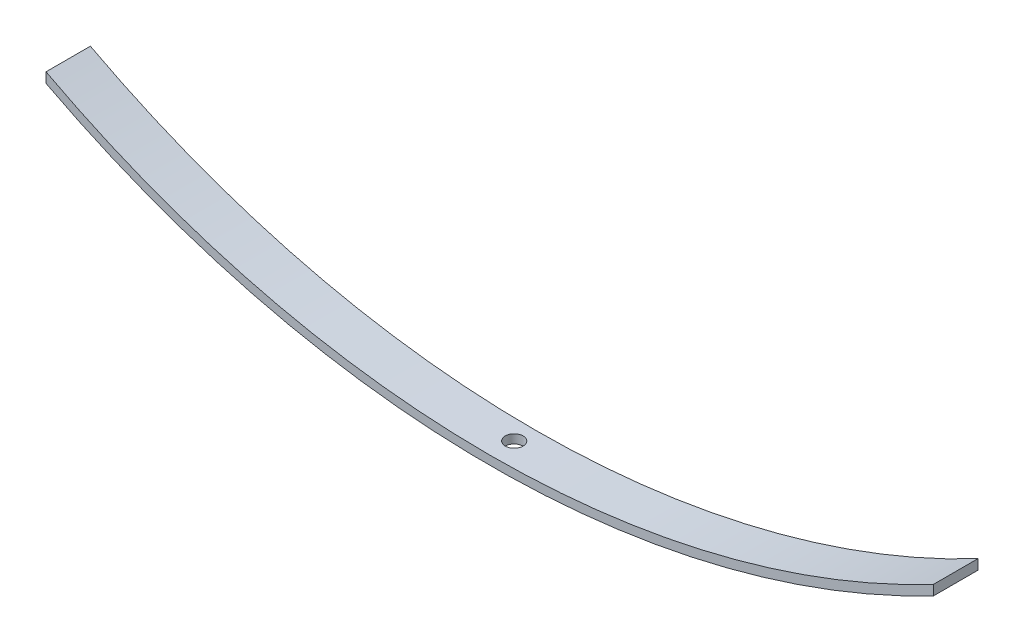
ISO-10303-21;
HEADER;
FILE_DESCRIPTION(('STEP AP214'),'2;1');
FILE_NAME('part.step','',(''),(''),'','','');
FILE_SCHEMA(('AUTOMOTIVE_DESIGN { 1 0 10303 214 1 1 1 1 }'));
ENDSEC;
DATA;
#1=APPLICATION_CONTEXT('core data for automotive mechanical design processes');
#2=APPLICATION_PROTOCOL_DEFINITION('international standard','automotive_design',2000,#1);
#3=PRODUCT_CONTEXT('',#1,'mechanical');
#4=PRODUCT('Part','Part','',(#3));
#5=PRODUCT_RELATED_PRODUCT_CATEGORY('part','',(#4));
#6=PRODUCT_DEFINITION_FORMATION('','',#4);
#7=PRODUCT_DEFINITION_CONTEXT('part definition',#1,'design');
#8=PRODUCT_DEFINITION('design','',#6,#7);
#9=PRODUCT_DEFINITION_SHAPE('','',#8);
#10=(LENGTH_UNIT() NAMED_UNIT(*) SI_UNIT(.MILLI.,.METRE.));
#11=(NAMED_UNIT(*) PLANE_ANGLE_UNIT() SI_UNIT($,.RADIAN.));
#12=(NAMED_UNIT(*) SI_UNIT($,.STERADIAN.) SOLID_ANGLE_UNIT());
#13=UNCERTAINTY_MEASURE_WITH_UNIT(LENGTH_MEASURE(1.E-05),#10,'distance_accuracy_value','');
#14=(GEOMETRIC_REPRESENTATION_CONTEXT(3) GLOBAL_UNCERTAINTY_ASSIGNED_CONTEXT((#13)) GLOBAL_UNIT_ASSIGNED_CONTEXT((#10,
#11,#12)) REPRESENTATION_CONTEXT('',''));
#15=CARTESIAN_POINT('',(0.,0.,0.));
#16=DIRECTION('',(0.,0.,1.));
#17=DIRECTION('',(1.,0.,0.));
#18=AXIS2_PLACEMENT_3D('',#15,#16,#17);
#19=CARTESIAN_POINT('',(-500.,-957.287835501946,50.));
#20=DIRECTION('',(-1.,0.,0.));
#21=DIRECTION('',(0.,-1.,0.));
#22=AXIS2_PLACEMENT_3D('',#19,#20,#21);
#23=PLANE('',#22);
#24=DIRECTION('',(0.,1.,0.));
#25=VECTOR('',#24,1.);
#26=CARTESIAN_POINT('',(-500.,-957.287835501946,0.));
#27=LINE('',#26,#25);
#28=CARTESIAN_POINT('',(-500.,-957.287835501946,0.));
#29=VERTEX_POINT('',#28);
#30=CARTESIAN_POINT('',(-500.,-945.991543302581,0.));
#31=VERTEX_POINT('',#30);
#32=EDGE_CURVE('E117',#29,#31,#27,.T.);
#33=ORIENTED_EDGE('',*,*,#32,.F.);
#34=DIRECTION('',(0.,0.,-1.));
#35=VECTOR('',#34,1.);
#36=CARTESIAN_POINT('',(-500.,-957.287835501946,50.));
#37=LINE('',#36,#35);
#38=CARTESIAN_POINT('',(-500.,-957.287835501946,50.));
#39=VERTEX_POINT('',#38);
#40=EDGE_CURVE('E11',#39,#29,#37,.T.);
#41=ORIENTED_EDGE('',*,*,#40,.F.);
#42=DIRECTION('',(0.,1.,0.));
#43=VECTOR('',#42,1.);
#44=CARTESIAN_POINT('',(-500.,-957.287835501946,50.));
#45=LINE('',#44,#43);
#46=CARTESIAN_POINT('',(-500.,-945.991543302581,50.));
#47=VERTEX_POINT('',#46);
#48=EDGE_CURVE('E109',#39,#47,#45,.T.);
#49=ORIENTED_EDGE('',*,*,#48,.T.);
#50=DIRECTION('',(0.,0.,-1.));
#51=VECTOR('',#50,1.);
#52=CARTESIAN_POINT('',(-500.,-945.991543302581,50.));
#53=LINE('',#52,#51);
#54=EDGE_CURVE('E85',#47,#31,#53,.T.);
#55=ORIENTED_EDGE('',*,*,#54,.T.);
#56=EDGE_LOOP('',(#33,#41,#49,#55));
#57=FACE_BOUND('',#56,.T.);
#58=ADVANCED_FACE('F39',(#57),#23,.T.);
#59=CARTESIAN_POINT('',(0.,0.,50.));
#60=DIRECTION('',(0.,0.,-1.));
#61=DIRECTION('',(-1.,0.,0.));
#62=AXIS2_PLACEMENT_3D('',#59,#60,#61);
#63=CYLINDRICAL_SURFACE('',#62,1080.);
#64=CARTESIAN_POINT('',(0.,-1080.,32.5));
#65=CARTESIAN_POINT('',(0.280946830993139,-1080.00000005212,32.5000020218661));
#66=CARTESIAN_POINT('',(0.561860503197048,-1079.9998901425,32.4881554676291));
#67=CARTESIAN_POINT('',(1.12178483729184,-1079.99945368572,32.440851992922));
#68=CARTESIAN_POINT('',(1.40079497943695,-1079.99912708161,32.4053888657761));
#69=CARTESIAN_POINT('',(1.95512868065271,-1079.99826592066,32.3110453070886));
#70=CARTESIAN_POINT('',(2.23044799622377,-1079.99773114268,32.2521399718246));
#71=CARTESIAN_POINT('',(2.77514735994904,-1079.99646885303,32.1113311821343));
#72=CARTESIAN_POINT('',(3.04452730281656,-1079.99574133795,32.0294273203683));
#73=CARTESIAN_POINT('',(3.57529212522385,-1079.9941146546,31.8432511000017));
#74=CARTESIAN_POINT('',(3.8366809041254,-1079.99321557165,31.7389898565638));
#75=CARTESIAN_POINT('',(4.34974892135516,-1079.9912710316,31.5088145788331));
#76=CARTESIAN_POINT('',(4.60142800642967,-1079.99022557219,31.3829002029474));
#77=CARTESIAN_POINT('',(5.09322206270993,-1079.98801824419,31.1103487817793));
#78=CARTESIAN_POINT('',(5.33333986077639,-1079.98685640427,30.9637168370231));
#79=CARTESIAN_POINT('',(5.80036612162051,-1079.98444909752,30.650752492377));
#80=CARTESIAN_POINT('',(6.02727486576485,-1079.98320363246,30.4844205123477));
#81=CARTESIAN_POINT('',(6.46630720988523,-1079.98066421508,30.1332107715757));
#82=CARTESIAN_POINT('',(6.67842870908606,-1079.97937025591,29.9483303847854));
#83=CARTESIAN_POINT('',(7.08634359206412,-1079.97677074406,29.5613575338946));
#84=CARTESIAN_POINT('',(7.28213695902863,-1079.97546519138,29.3592650520716));
#85=CARTESIAN_POINT('',(7.6560108561917,-1079.97287950121,28.9392965186679));
#86=CARTESIAN_POINT('',(7.83409069574824,-1079.97159936472,28.7214198522413));
#87=CARTESIAN_POINT('',(8.1712628178961,-1079.96910089973,28.2714388104494));
#88=CARTESIAN_POINT('',(8.33035510411368,-1079.96788257121,28.0393344378013));
#89=CARTESIAN_POINT('',(8.62842099958237,-1079.96554230861,27.5625480867652));
#90=CARTESIAN_POINT('',(8.76739462028087,-1079.96442037447,27.3178661155338));
#91=CARTESIAN_POINT('',(9.02423519233012,-1079.96230475039,26.8176638970605));
#92=CARTESIAN_POINT('',(9.14210214295948,-1079.96131106045,26.5621436494481));
#93=CARTESIAN_POINT('',(9.35589104374611,-1079.95948013732,26.0420820221502));
#94=CARTESIAN_POINT('',(9.45181304149456,-1079.95864290379,25.7775406620299));
#95=CARTESIAN_POINT('',(9.62103026305726,-1079.95714866038,25.241317060164));
#96=CARTESIAN_POINT('',(9.69432548758416,-1079.95649165051,24.9696348186434));
#97=CARTESIAN_POINT('',(9.81776625564527,-1079.95537652278,24.4210685195311));
#98=CARTESIAN_POINT('',(9.86791242792046,-1079.95491839952,24.1441846034323));
#99=CARTESIAN_POINT('',(9.94470141817235,-1079.9542140254,23.5871763367607));
#100=CARTESIAN_POINT('',(9.9713442365628,-1079.95396777453,23.307051986245));
#101=CARTESIAN_POINT('',(10.0009370161434,-1079.95369413652,22.7455550452727));
#102=CARTESIAN_POINT('',(10.0038870244512,-1079.95366674896,22.4641824572998));
#103=CARTESIAN_POINT('',(9.9860733277684,-1079.95383161413,21.9021890106005));
#104=CARTESIAN_POINT('',(9.96530962319048,-1079.95402386687,21.6215681518612));
#105=CARTESIAN_POINT('',(9.90021715618329,-1079.95462254524,21.0630818145463));
#106=CARTESIAN_POINT('',(9.85588910924836,-1079.95502896438,20.7852162525714));
#107=CARTESIAN_POINT('',(9.74398361899045,-1079.95604443403,20.2342072770111));
#108=CARTESIAN_POINT('',(9.67640617618953,-1079.95665348453,19.9610638633197));
#109=CARTESIAN_POINT('',(9.5184823256382,-1079.95805692786,19.421440662503));
#110=CARTESIAN_POINT('',(9.42813589210945,-1079.95885132089,19.1549608829225));
#111=CARTESIAN_POINT('',(9.22531648275569,-1079.9606028983,18.6305596141169));
#112=CARTESIAN_POINT('',(9.11284350640294,-1079.96156008268,18.3726381250958));
#113=CARTESIAN_POINT('',(8.86656878874518,-1079.96361008723,17.8671830227862));
#114=CARTESIAN_POINT('',(8.73276672223304,-1079.96470290946,17.6196495679578));
#115=CARTESIAN_POINT('',(8.44478631650534,-1079.96699315679,17.1367342931325));
#116=CARTESIAN_POINT('',(8.2906079771651,-1079.96819058189,16.9013524732098));
#117=CARTESIAN_POINT('',(7.9629711133764,-1079.97065604481,16.4444136717694));
#118=CARTESIAN_POINT('',(7.78951259254884,-1079.97192408261,16.2228566876553));
#119=CARTESIAN_POINT('',(7.42454839422626,-1079.97449477788,15.7951423767921));
#120=CARTESIAN_POINT('',(7.2330427162563,-1079.97579743535,15.5889850504484));
#121=CARTESIAN_POINT('',(6.83333795236948,-1079.9784004436,15.1935280096799));
#122=CARTESIAN_POINT('',(6.62513823720578,-1079.97970079429,15.0042289312597));
#123=CARTESIAN_POINT('',(6.19353172013911,-1079.98226222741,14.6438428339984));
#124=CARTESIAN_POINT('',(5.97012491782503,-1079.98352330983,14.4727558156496));
#125=CARTESIAN_POINT('',(5.50969233445025,-1079.98597040901,14.150010112189));
#126=CARTESIAN_POINT('',(5.27266655134777,-1079.98715642574,13.9983514299899));
#127=CARTESIAN_POINT('',(4.78668101877967,-1079.98941972652,13.7155406661651));
#128=CARTESIAN_POINT('',(4.53772126945362,-1079.99049701057,13.5843885842996));
#129=CARTESIAN_POINT('',(4.02963744185973,-1079.99251226629,13.3435234148167));
#130=CARTESIAN_POINT('',(3.77051335463881,-1079.99345023783,13.233810346084));
#131=CARTESIAN_POINT('',(3.24394324915048,-1079.99516024107,13.0366034717934));
#132=CARTESIAN_POINT('',(2.97649723084286,-1079.99593227276,12.9491096663429));
#133=CARTESIAN_POINT('',(2.43518476578343,-1079.99728848002,12.796963514242));
#134=CARTESIAN_POINT('',(2.16131832065999,-1079.99787265563,12.7323111617987));
#135=CARTESIAN_POINT('',(1.60911209118594,-1079.99883656744,12.6263076619849));
#136=CARTESIAN_POINT('',(1.33077230697676,-1079.99921630364,12.5849565138779));
#137=CARTESIAN_POINT('',(0.771608807900758,-1079.9997605465,12.5258506003383));
#138=CARTESIAN_POINT('',(0.490785185734503,-1079.99992506116,12.5080949579956));
#139=CARTESIAN_POINT('',(-0.0713596417628769,-1080.00003421713,12.4963034703321));
#140=CARTESIAN_POINT('',(-0.35268084708176,-1079.99997885844,12.5022676244279));
#141=CARTESIAN_POINT('',(-0.91382072087917,-1079.99964983916,12.5378733134857));
#142=CARTESIAN_POINT('',(-1.19363938945646,-1079.99937617858,12.5675148468914));
#143=CARTESIAN_POINT('',(-1.74978481047988,-1079.99861832373,12.6502644997231));
#144=CARTESIAN_POINT('',(-2.0261115629332,-1079.99813412945,12.7033726191009));
#145=CARTESIAN_POINT('',(-2.57330391399844,-1079.99696896159,12.8326766701471));
#146=CARTESIAN_POINT('',(-2.84416960645182,-1079.99628799138,12.9088722047261));
#147=CARTESIAN_POINT('',(-3.37851916238579,-1079.99474859754,13.0838096128953));
#148=CARTESIAN_POINT('',(-3.64200302598271,-1079.9938901739,13.1825514861301));
#149=CARTESIAN_POINT('',(-4.15971591512815,-1079.99202023886,13.4018795146803));
#150=CARTESIAN_POINT('',(-4.4139449404069,-1079.99100872744,13.5224656706323));
#151=CARTESIAN_POINT('',(-4.91134099008323,-1079.98886132745,13.7846249497716));
#152=CARTESIAN_POINT('',(-5.15450801414461,-1079.98772543887,13.9261980735967));
#153=CARTESIAN_POINT('',(-5.62805856512507,-1079.98536149022,14.2293293029079));
#154=CARTESIAN_POINT('',(-5.85844171527824,-1079.98413342744,14.3908879969553));
#155=CARTESIAN_POINT('',(-6.30477912256011,-1079.9816200184,14.7328385470357));
#156=CARTESIAN_POINT('',(-6.52073337943143,-1079.98033467214,14.9132304034045));
#157=CARTESIAN_POINT('',(-6.93667803477774,-1079.97774317989,15.2915650346871));
#158=CARTESIAN_POINT('',(-7.13666842389908,-1079.97643703389,15.4895078198843));
#159=CARTESIAN_POINT('',(-7.51926357718869,-1079.97384101818,15.9015371438356));
#160=CARTESIAN_POINT('',(-7.70186834107311,-1079.97255114848,16.1156236828533));
#161=CARTESIAN_POINT('',(-8.04839946183083,-1079.97002426045,16.5584254760602));
#162=CARTESIAN_POINT('',(-8.21232524764429,-1079.96878724374,16.7871411771634));
#163=CARTESIAN_POINT('',(-8.52032654745661,-1079.96640122,17.2575695110974));
#164=CARTESIAN_POINT('',(-8.66440206099904,-1079.96525221297,17.4992821442271));
#165=CARTESIAN_POINT('',(-8.93167830191261,-1079.96307482852,17.9939857220713));
#166=CARTESIAN_POINT('',(-9.05487905301033,-1079.96204645097,18.2469766539662));
#167=CARTESIAN_POINT('',(-9.27952996501027,-1079.96013951916,18.7624385138751));
#168=CARTESIAN_POINT('',(-9.38098012645896,-1079.9592609649,19.0249094416509));
#169=CARTESIAN_POINT('',(-9.56140695898478,-1079.95767863521,19.5574608163621));
#170=CARTESIAN_POINT('',(-9.64038400514027,-1079.95697485685,19.8275411362134));
#171=CARTESIAN_POINT('',(-9.7753052527145,-1079.95576204032,20.3733953465551));
#172=CARTESIAN_POINT('',(-9.83124945427578,-1079.95525300215,20.6491692370102));
#173=CARTESIAN_POINT('',(-9.91970723727702,-1079.95444411721,21.2044503396452));
#174=CARTESIAN_POINT('',(-9.95222078150988,-1079.95414427077,21.4839575577527));
#175=CARTESIAN_POINT('',(-9.99358587528078,-1079.95376228377,22.0447175937094));
#176=CARTESIAN_POINT('',(-10.0024374254284,-1079.95368014322,22.3259704115137));
#177=CARTESIAN_POINT('',(-9.99641570123941,-1079.95373589887,22.8882108623938));
#178=CARTESIAN_POINT('',(-9.98154335956891,-1079.95387378643,23.16919850546));
#179=CARTESIAN_POINT('',(-9.92818136288653,-1079.95436566761,23.7289220060057));
#180=CARTESIAN_POINT('',(-9.8896917084794,-1079.95471966123,24.0076578635429));
#181=CARTESIAN_POINT('',(-9.78936869165727,-1079.95563370582,24.5608967132813));
#182=CARTESIAN_POINT('',(-9.72753528247904,-1079.95619375719,24.835399697002));
#183=CARTESIAN_POINT('',(-9.58096445399798,-1079.95750401824,25.378220727086));
#184=CARTESIAN_POINT('',(-9.49622703483393,-1079.9582542279,25.6465387734868));
#185=CARTESIAN_POINT('',(-9.30444893694187,-1079.95992352398,26.1750873526153));
#186=CARTESIAN_POINT('',(-9.19740784676534,-1079.96084261352,26.4353177360436));
#187=CARTESIAN_POINT('',(-8.96178441771633,-1079.96282356923,26.9458359018268));
#188=CARTESIAN_POINT('',(-8.83320207472319,-1079.96388543542,27.1961236822799));
#189=CARTESIAN_POINT('',(-8.55541572186873,-1079.96612175732,27.6849679134986));
#190=CARTESIAN_POINT('',(-8.40621250969461,-1079.96729620867,27.9235248175718));
#191=CARTESIAN_POINT('',(-8.08824143301179,-1079.96972439844,28.3872218037586));
#192=CARTESIAN_POINT('',(-7.91947358769898,-1079.97097813678,28.6123618990358));
#193=CARTESIAN_POINT('',(-7.56358659276229,-1079.97352921692,29.0476083793136));
#194=CARTESIAN_POINT('',(-7.37646886715792,-1079.97482655533,29.2577159287109));
#195=CARTESIAN_POINT('',(-6.98519681697802,-1079.97742813892,29.6614276791821));
#196=CARTESIAN_POINT('',(-6.78104212858852,-1079.97873238425,29.855031527651));
#197=CARTESIAN_POINT('',(-6.35709826309957,-1079.98131105801,30.224400393115));
#198=CARTESIAN_POINT('',(-6.13730525038273,-1079.98258547901,30.4001610078621));
#199=CARTESIAN_POINT('',(-5.68369585853967,-1079.98506796693,30.7325366209558));
#200=CARTESIAN_POINT('',(-5.44987970073429,-1079.98627603489,30.8891519213455));
#201=CARTESIAN_POINT('',(-4.96976007141037,-1079.98859213072,31.182201482485));
#202=CARTESIAN_POINT('',(-4.72345027585649,-1079.98970010713,31.3186253830647));
#203=CARTESIAN_POINT('',(-4.22021276110309,-1079.99178381616,31.5702228604991));
#204=CARTESIAN_POINT('',(-3.96328523005301,-1079.99275955113,31.6853968137117));
#205=CARTESIAN_POINT('',(-3.44090930056789,-1079.99455011157,31.8935671901833));
#206=CARTESIAN_POINT('',(-3.17547026177008,-1079.9953651072,31.9865870861568));
#207=CARTESIAN_POINT('',(-2.63779025128926,-1079.99681219396,32.1499225799908));
#208=CARTESIAN_POINT('',(-2.36555108615882,-1079.99744433313,32.2202441403109));
#209=CARTESIAN_POINT('',(-1.74753723591332,-1079.99864065029,32.3523743153585));
#210=CARTESIAN_POINT('',(-1.40035453775591,-1079.9991485695,32.4076869153147));
#211=CARTESIAN_POINT('',(-0.702097305266922,-1079.99982821179,32.4814984940421));
#212=CARTESIAN_POINT('',(-0.351022771042235,-1079.99999993487,32.4999974738243));
#213=CARTESIAN_POINT('',(0.,-1080.,32.5));
#214=B_SPLINE_CURVE_WITH_KNOTS('',3,(#64,#65,#66,#67,#68,#69,#70,#71,#72,#73,#74,#75,#76,#77,
#78,#79,#80,#81,#82,#83,#84,#85,#86,#87,#88,#89,#90,#91,#92,#93,#94,#95,#96,#97,#98,#99,#100,
#101,#102,#103,#104,#105,#106,#107,#108,#109,#110,#111,#112,#113,#114,#115,#116,#117,#118,#119,
#120,#121,#122,#123,#124,#125,#126,#127,#128,#129,#130,#131,#132,#133,#134,#135,#136,#137,#138,
#139,#140,#141,#142,#143,#144,#145,#146,#147,#148,#149,#150,#151,#152,#153,#154,#155,#156,#157,
#158,#159,#160,#161,#162,#163,#164,#165,#166,#167,#168,#169,#170,#171,#172,#173,#174,#175,#176,
#177,#178,#179,#180,#181,#182,#183,#184,#185,#186,#187,#188,#189,#190,#191,#192,#193,#194,#195,
#196,#197,#198,#199,#200,#201,#202,#203,#204,#205,#206,#207,#208,#209,#210,#211,#212,#213),
.UNSPECIFIED.,.T.,.F.,(4,2,2,2,2,2,2,2,2,2,2,2,2,2,2,2,2,2,2,2,2,2,2,2,2,2,2,2,2,2,2,2,2,2,2,2,
2,2,2,2,2,2,2,2,2,2,2,2,2,2,2,2,2,2,2,2,2,2,2,2,2,2,2,2,2,2,2,2,2,2,2,2,2,2,4),(0.,
0.842533872651942,1.68528925921438,2.52894234333142,3.37261037079926,4.21585992995773,
5.05912279316949,5.90217841130945,6.74521606490536,7.58837324303029,8.43153128932497,
9.27472219707642,10.1179129437945,10.9611032107406,11.8042935065059,12.6474819736593,
13.4906704142552,14.3338359520421,15.1770014749864,16.0201653211388,16.8633291526226,
17.70646738422,18.5496055968852,19.3927447641297,20.2358839514834,21.0790359955084,
21.9221880446924,22.7653399355293,23.6084918485557,24.4516755573844,25.2948592890078,
26.1380431470419,26.9812269952139,27.8244115861068,28.6675961810744,29.5107805621929,
30.3539649166538,31.1971179338902,32.0402709303844,32.8834238714562,33.7265768107927,
34.5697152492348,35.4128536743908,36.2559921241222,37.0991305994778,37.9422939105989,
38.7854572367599,39.6286210569491,40.4717848909043,41.314974495428,42.1581641193394,
43.0013527848616,43.8445414291985,44.6877159998135,45.5308905652103,46.3740664695371,
47.2172423521434,48.060385087485,48.9035278012363,49.7466722040168,50.5898166016884,
51.4329765547023,52.2761366690061,53.119264176058,53.9623908558805,54.8054521576111,
55.6485314670119,56.4918182763788,57.3350917800392,58.1787964768337,59.022486229334,
59.8652780570296,60.7078483173977,61.7605335594866,62.8132187726629),.UNSPECIFIED.);
#215=CARTESIAN_POINT('',(0.,-1080.,32.5));
#216=VERTEX_POINT('',#215);
#217=EDGE_CURVE('E122',#216,#216,#214,.T.);
#218=ORIENTED_EDGE('',*,*,#217,.T.);
#219=EDGE_LOOP('',(#218));
#220=FACE_BOUND('',#219,.T.);
#221=CARTESIAN_POINT('',(0.,0.,0.));
#222=DIRECTION('',(0.,0.,1.));
#223=DIRECTION('',(1.,0.,0.));
#224=AXIS2_PLACEMENT_3D('',#221,#222,#223);
#225=CIRCLE('',#224,1080.);
#226=CARTESIAN_POINT('',(500.,-957.287835501946,0.));
#227=VERTEX_POINT('',#226);
#228=EDGE_CURVE('E77',#29,#227,#225,.T.);
#229=ORIENTED_EDGE('',*,*,#228,.T.);
#230=DIRECTION('',(0.,0.,-1.));
#231=VECTOR('',#230,1.);
#232=CARTESIAN_POINT('',(500.,-957.287835501946,50.));
#233=LINE('',#232,#231);
#234=CARTESIAN_POINT('',(500.,-957.287835501946,50.));
#235=VERTEX_POINT('',#234);
#236=EDGE_CURVE('E53',#235,#227,#233,.T.);
#237=ORIENTED_EDGE('',*,*,#236,.F.);
#238=CARTESIAN_POINT('',(0.,0.,50.));
#239=DIRECTION('',(0.,0.,1.));
#240=DIRECTION('',(1.,0.,0.));
#241=AXIS2_PLACEMENT_3D('',#238,#239,#240);
#242=CIRCLE('',#241,1080.);
#243=EDGE_CURVE('E95',#39,#235,#242,.T.);
#244=ORIENTED_EDGE('',*,*,#243,.F.);
#245=ORIENTED_EDGE('',*,*,#40,.T.);
#246=EDGE_LOOP('',(#229,#237,#244,#245));
#247=FACE_BOUND('',#246,.T.);
#248=ADVANCED_FACE('F144',(#220,#247),#63,.T.);
#249=CARTESIAN_POINT('',(500.,-957.287835501946,50.));
#250=DIRECTION('',(-1.,0.,0.));
#251=DIRECTION('',(0.,0.,1.));
#252=AXIS2_PLACEMENT_3D('',#249,#250,#251);
#253=PLANE('',#252);
#254=DIRECTION('',(0.,1.,0.));
#255=VECTOR('',#254,1.);
#256=CARTESIAN_POINT('',(500.,-957.287835501946,0.));
#257=LINE('',#256,#255);
#258=CARTESIAN_POINT('',(500.,-945.991543302582,0.));
#259=VERTEX_POINT('',#258);
#260=EDGE_CURVE('E103',#227,#259,#257,.T.);
#261=ORIENTED_EDGE('',*,*,#260,.T.);
#262=DIRECTION('',(0.,0.,-1.));
#263=VECTOR('',#262,1.);
#264=CARTESIAN_POINT('',(500.,-945.991543302582,50.));
#265=LINE('',#264,#263);
#266=CARTESIAN_POINT('',(500.,-945.991543302582,50.));
#267=VERTEX_POINT('',#266);
#268=EDGE_CURVE('E100',#267,#259,#265,.T.);
#269=ORIENTED_EDGE('',*,*,#268,.F.);
#270=DIRECTION('',(0.,1.,0.));
#271=VECTOR('',#270,1.);
#272=CARTESIAN_POINT('',(500.,-957.287835501946,50.));
#273=LINE('',#272,#271);
#274=EDGE_CURVE('E90',#235,#267,#273,.T.);
#275=ORIENTED_EDGE('',*,*,#274,.F.);
#276=ORIENTED_EDGE('',*,*,#236,.T.);
#277=EDGE_LOOP('',(#261,#269,#275,#276));
#278=FACE_BOUND('',#277,.T.);
#279=ADVANCED_FACE('F101',(#278),#253,.F.);
#280=CARTESIAN_POINT('',(0.,0.,50.));
#281=DIRECTION('',(0.,0.,-1.));
#282=DIRECTION('',(-1.,0.,0.));
#283=AXIS2_PLACEMENT_3D('',#280,#281,#282);
#284=CYLINDRICAL_SURFACE('',#283,1070.);
#285=CARTESIAN_POINT('',(0.,-1070.,32.5));
#286=CARTESIAN_POINT('',(0.280946709399363,-1070.00000005261,32.5000020219782));
#287=CARTESIAN_POINT('',(0.561860258569175,-1069.99988911589,32.4881554779434));
#288=CARTESIAN_POINT('',(1.12178434572434,-1069.99944858046,32.4408520448031));
#289=CARTESIAN_POINT('',(1.40079436397135,-1069.99911892426,32.4053889491154));
#290=CARTESIAN_POINT('',(1.9551278123037,-1069.99824971584,32.3110454763084));
#291=CARTESIAN_POINT('',(2.23044699894896,-1069.99770994041,32.2521401958444));
#292=CARTESIAN_POINT('',(2.77514610562203,-1069.99643585478,32.1113315401694));
#293=CARTESIAN_POINT('',(3.04452592036136,-1069.99570154112,32.0294277576122));
#294=CARTESIAN_POINT('',(3.57529048389846,-1069.99405965653,31.843251723385));
#295=CARTESIAN_POINT('',(3.83667913222468,-1069.99315217171,31.7389905873443));
#296=CARTESIAN_POINT('',(4.34974689538885,-1069.99118946,31.5088155518721));
#297=CARTESIAN_POINT('',(4.60142585697582,-1069.99013423078,31.382901310854));
#298=CARTESIAN_POINT('',(5.09321968019005,-1069.98790627522,31.1103501854637));
#299=CARTESIAN_POINT('',(5.3333373685907,-1069.98673357782,30.9637184014588));
#300=CARTESIAN_POINT('',(5.80036342768898,-1069.98430377445,30.6507544032666));
#301=CARTESIAN_POINT('',(6.02727207974481,-1069.98304667028,30.4844226089271));
#302=CARTESIAN_POINT('',(6.46630437336098,-1069.98048352069,30.1332131728421));
#303=CARTESIAN_POINT('',(6.67842590669653,-1069.97917746834,29.9483328957356));
#304=CARTESIAN_POINT('',(7.08634086928212,-1069.97655366153,29.5613602644561));
#305=CARTESIAN_POINT('',(7.28213428171446,-1069.97523590706,29.3592678925554));
#306=CARTESIAN_POINT('',(7.65600828359203,-1069.97262605058,28.93929957536));
#307=CARTESIAN_POINT('',(7.83408818237894,-1069.97133394958,28.7214230152045));
#308=CARTESIAN_POINT('',(8.17126043767984,-1069.96881213292,28.2714421783338));
#309=CARTESIAN_POINT('',(8.33035279781838,-1069.96758241725,28.0393379043347));
#310=CARTESIAN_POINT('',(8.62841890604349,-1069.9652202806,27.5625516582053));
#311=CARTESIAN_POINT('',(8.76739265877536,-1069.9640878596,27.3178696889792));
#312=CARTESIAN_POINT('',(9.02423349328664,-1069.96195246023,26.817667452605));
#313=CARTESIAN_POINT('',(9.14210057433841,-1069.96094948187,26.5621471850833));
#314=CARTESIAN_POINT('',(9.35588973070462,-1069.95910144411,26.042085496426));
#315=CARTESIAN_POINT('',(9.45181185367025,-1069.95825638437,25.7775440948803));
#316=CARTESIAN_POINT('',(9.62102931702547,-1069.95674817298,25.2413203891744));
#317=CARTESIAN_POINT('',(9.6943246581406,-1069.95608502133,24.9696380852433));
#318=CARTESIAN_POINT('',(9.8177656134568,-1069.95495946936,24.4210717927941));
#319=CARTESIAN_POINT('',(9.86791186903572,-1069.95449706348,24.1441879486132));
#320=CARTESIAN_POINT('',(9.94470103652754,-1069.95378610425,23.5871798139389));
#321=CARTESIAN_POINT('',(9.97134394886183,-1069.9535375509,23.3070555235036));
#322=CARTESIAN_POINT('',(10.0009369251396,-1069.95326135348,22.745558693575));
#323=CARTESIAN_POINT('',(10.0038870362827,-1069.95323370897,22.4641861565695));
#324=CARTESIAN_POINT('',(9.98607355343044,-1069.95340011308,21.9021928039145));
#325=CARTESIAN_POINT('',(9.96530995985493,-1069.95359416169,21.6215719882517));
#326=CARTESIAN_POINT('',(9.90021774194708,-1069.95419843338,21.063085892533));
#327=CARTESIAN_POINT('',(9.85588984671182,-1069.95460864978,20.7852205274923));
#328=CARTESIAN_POINT('',(9.74398469566442,-1069.95563360758,20.2342119346919));
#329=CARTESIAN_POINT('',(9.67640744038471,-1069.95624834898,19.9610687068241));
#330=CARTESIAN_POINT('',(9.51848400086335,-1069.95766490618,19.4214458629587));
#331=CARTESIAN_POINT('',(9.42813779081109,-1069.95846672219,19.1549662545155));
#332=CARTESIAN_POINT('',(9.22531886426693,-1069.96023466691,18.6305653092706));
#333=CARTESIAN_POINT('',(9.11284614723762,-1069.96120079564,18.3726439726769));
#334=CARTESIAN_POINT('',(8.86657194696063,-1069.96326995678,17.8671890771995));
#335=CARTESIAN_POINT('',(8.73277013226973,-1069.96437299132,17.6196556798146));
#336=CARTESIAN_POINT('',(8.44479025088656,-1069.96668464098,17.1367404971639));
#337=CARTESIAN_POINT('',(8.29061218406701,-1069.9678932561,16.901358711974));
#338=CARTESIAN_POINT('',(7.96297588230343,-1069.97038175916,16.4444199511567));
#339=CARTESIAN_POINT('',(7.78951765090164,-1069.97166164708,16.2228629729893));
#340=CARTESIAN_POINT('',(7.42455404435858,-1069.97425636637,15.7951486411169));
#341=CARTESIAN_POINT('',(7.2330486687334,-1069.97557119774,15.5889912878247));
#342=CARTESIAN_POINT('',(6.83334437545968,-1069.97819853345,15.1935340163514));
#343=CARTESIAN_POINT('',(6.62514481679003,-1069.97951103771,15.0042347460743));
#344=CARTESIAN_POINT('',(6.19353859250773,-1069.98209641127,14.6438482514079));
#345=CARTESIAN_POINT('',(5.97013192647632,-1069.98336928057,14.4727610275199));
#346=CARTESIAN_POINT('',(5.50969959167318,-1069.98583925222,14.1500149001624));
#347=CARTESIAN_POINT('',(5.27267392085478,-1069.98703635456,13.9983559996124));
#348=CARTESIAN_POINT('',(4.78668858570178,-1069.98932081062,13.7155447885444));
#349=CARTESIAN_POINT('',(4.53772892150938,-1069.99040816434,13.584392477782));
#350=CARTESIAN_POINT('',(4.02964523023157,-1069.99244225764,13.343526841121));
#351=CARTESIAN_POINT('',(3.77052119401569,-1069.99338899709,13.2338135344812));
#352=CARTESIAN_POINT('',(3.24395115983016,-1069.99511498549,13.0366061819905));
#353=CARTESIAN_POINT('',(2.97650516181951,-1069.99589423442,12.949112136249));
#354=CARTESIAN_POINT('',(2.4351927085557,-1069.99726312058,12.7969655059618));
#355=CARTESIAN_POINT('',(2.16132625495606,-1069.99785275785,12.7323129155336));
#356=CARTESIAN_POINT('',(1.60911998119206,-1069.99882568237,12.6263089459468));
#357=CARTESIAN_POINT('',(1.33078016117178,-1069.99920896961,12.5849575660377));
#358=CARTESIAN_POINT('',(0.771616762050557,-1069.99975830284,12.5258512192009));
#359=CARTESIAN_POINT('',(0.490793277391732,-1069.99992435705,12.5080953588967));
#360=CARTESIAN_POINT('',(-0.0713512948975508,-1070.00003453744,12.4963034142504));
#361=CARTESIAN_POINT('',(-0.352672382515536,-1069.99997866362,12.5022673293137));
#362=CARTESIAN_POINT('',(-0.913812039534931,-1069.99964657401,12.5378725206576));
#363=CARTESIAN_POINT('',(-1.19363060903823,-1069.99937035824,12.5675137953324));
#364=CARTESIAN_POINT('',(-1.7497758508029,-1069.99860542548,12.6502629117168));
#365=CARTESIAN_POINT('',(-2.0261025230716,-1069.99811670848,12.7033707533772));
#366=CARTESIAN_POINT('',(-2.57329464434592,-1069.9969406563,12.8326742092626));
#367=CARTESIAN_POINT('',(-2.84416018895979,-1069.9962533246,12.9088694189209));
#368=CARTESIAN_POINT('',(-3.37850947532746,-1069.99469954933,13.0838061441901));
#369=CARTESIAN_POINT('',(-3.64199321719978,-1069.99383310577,13.182547659439));
#370=CARTESIAN_POINT('',(-4.15970589433161,-1069.99194570003,13.4018749406224));
#371=CARTESIAN_POINT('',(-4.4139348292936,-1069.99092473785,13.522460707259));
#372=CARTESIAN_POINT('',(-4.91133073448293,-1069.98875727368,13.7846191786094));
#373=CARTESIAN_POINT('',(-5.15449770436772,-1069.98761077169,13.926191883973));
#374=CARTESIAN_POINT('',(-5.62804832072535,-1069.98522473376,14.2293223353087));
#375=CARTESIAN_POINT('',(-5.85843158332697,-1069.98398519502,14.390880680943));
#376=CARTESIAN_POINT('',(-6.30476924676205,-1069.98144829814,14.7328305346174));
#377=CARTESIAN_POINT('',(-6.52072364733334,-1069.98015093999,14.9132220429996));
#378=CARTESIAN_POINT('',(-6.93666862510528,-1069.97753522893,15.291555984157));
#379=CARTESIAN_POINT('',(-7.13665919289806,-1069.976216876,15.4894984272751));
#380=CARTESIAN_POINT('',(-7.51925473997275,-1069.97359659786,15.9015270782127));
#381=CARTESIAN_POINT('',(-7.70185971896571,-1069.97229467266,16.1156132863003));
#382=CARTESIAN_POINT('',(-8.04839140577304,-1069.96974416613,16.5584145610562));
#383=CARTESIAN_POINT('',(-8.21231753191685,-1069.96849558647,16.7871300829439));
#384=CARTESIAN_POINT('',(-8.52031952595199,-1069.96608725878,17.2575580963166));
#385=CARTESIAN_POINT('',(-8.66439539337814,-1069.96492751075,17.4992705881062));
#386=CARTESIAN_POINT('',(-8.93167235157635,-1069.96272977122,17.9939739235596));
#387=CARTESIAN_POINT('',(-9.05487346610634,-1069.96169177959,18.2469647543868));
#388=CARTESIAN_POINT('',(-9.27952510989939,-1069.95976701951,18.7624264542783));
#389=CARTESIAN_POINT('',(-9.38097563971865,-1069.95888025107,19.0248973231001));
#390=CARTESIAN_POINT('',(-9.56140318093275,-1069.95728312651,19.5574485404603));
#391=CARTESIAN_POINT('',(-9.64038057428726,-1069.9565727674,19.8275287595821));
#392=CARTESIAN_POINT('',(-9.77530252465397,-1069.95534860922,20.373382805987));
#393=CARTESIAN_POINT('',(-9.83124708181193,-1069.95483481016,20.6491566332341));
#394=CARTESIAN_POINT('',(-9.91970557950575,-1069.95401835847,21.2044376442965));
#395=CARTESIAN_POINT('',(-9.95221948292979,-1069.95371570618,21.4839448340243));
#396=CARTESIAN_POINT('',(-9.99358529494173,-1069.95333014225,22.0447048463585));
#397=CARTESIAN_POINT('',(-10.0024372041507,-1069.9532472306,22.325957668919));
#398=CARTESIAN_POINT('',(-9.9964161971355,-1069.95330350068,22.8881979613776));
#399=CARTESIAN_POINT('',(-9.98154423024218,-1069.95344267352,23.1691854414434));
#400=CARTESIAN_POINT('',(-9.92818301130804,-1069.95393914495,23.7289086466021));
#401=CARTESIAN_POINT('',(-9.88969375988386,-1069.95429644353,24.0076443717537));
#402=CARTESIAN_POINT('',(-9.78937157565989,-1069.95521902388,24.5608829882929));
#403=CARTESIAN_POINT('',(-9.72753859610564,-1069.95578430606,24.8353858712016));
#404=CARTESIAN_POINT('',(-9.58096865212942,-1069.95710680606,25.3782067332176));
#405=CARTESIAN_POINT('',(-9.4962316878409,-1069.95786402387,25.6465247123611));
#406=CARTESIAN_POINT('',(-9.30445452363841,-1069.95954891476,26.1750731926403));
#407=CARTESIAN_POINT('',(-9.19741391233159,-1069.96047659099,26.4353035444972));
#408=CARTESIAN_POINT('',(-8.96179146256603,-1069.96247605477,26.9458216873728));
#409=CARTESIAN_POINT('',(-8.83320961998844,-1069.96354784234,27.1961094764904));
#410=CARTESIAN_POINT('',(-8.55542428540885,-1069.96580505963,27.684953771166));
#411=CARTESIAN_POINT('',(-8.4062215909967,-1069.96699048496,27.9235107299749));
#412=CARTESIAN_POINT('',(-8.0882515628819,-1069.96944136421,28.3872078756654));
#413=CARTESIAN_POINT('',(-7.91948424836325,-1069.97070681805,28.6123480757024));
#414=CARTESIAN_POINT('',(-7.56359819644914,-1069.9732817382,29.0475949734432));
#415=CARTESIAN_POINT('',(-7.37648087016257,-1069.97459120113,29.2577028249831));
#416=CARTESIAN_POINT('',(-6.9852095945659,-1069.977217099,29.6614152144389));
#417=CARTESIAN_POINT('',(-6.78105528143564,-1069.9785335341,29.855019399745));
#418=CARTESIAN_POINT('',(-6.35711213727609,-1069.98113630944,30.2243889733519));
#419=CARTESIAN_POINT('',(-6.13731947065003,-1069.9824226422,30.4001499594451));
#420=CARTESIAN_POINT('',(-5.68371073552112,-1069.98492833418,30.7325263487438));
#421=CARTESIAN_POINT('',(-5.4498948883363,-1069.98614769447,30.8891420539872));
#422=CARTESIAN_POINT('',(-4.96977576625828,-1069.98848544104,31.1821925004505));
#423=CARTESIAN_POINT('',(-4.72346616353871,-1069.98960377535,31.3186168753402));
#424=CARTESIAN_POINT('',(-4.22022898317543,-1069.99170696479,31.5702153146765));
#425=CARTESIAN_POINT('',(-3.96330159368536,-1069.99269182229,31.6853897554874));
#426=CARTESIAN_POINT('',(-3.4409258912913,-1069.9944991244,31.8935611152162));
#427=CARTESIAN_POINT('',(-3.17548693798505,-1069.99532174075,31.9865815066002));
#428=CARTESIAN_POINT('',(-2.63780704593059,-1069.99678235988,32.1499179917883));
#429=CARTESIAN_POINT('',(-2.36556791372968,-1069.99742041113,32.2202400479897));
#430=CARTESIAN_POINT('',(-1.74755139998691,-1069.99862792379,32.3523719047565));
#431=CARTESIAN_POINT('',(-1.40036592937559,-1069.99914059822,32.4076854069609));
#432=CARTESIAN_POINT('',(-0.702103050329409,-1069.99982660345,32.4814981908989));
#433=CARTESIAN_POINT('',(-0.351025642003469,-1069.99999993426,32.4999974736626));
#434=CARTESIAN_POINT('',(0.,-1070.,32.5));
#435=B_SPLINE_CURVE_WITH_KNOTS('',3,(#285,#286,#287,#288,#289,#290,#291,#292,#293,#294,#295,
#296,#297,#298,#299,#300,#301,#302,#303,#304,#305,#306,#307,#308,#309,#310,#311,#312,#313,#314,
#315,#316,#317,#318,#319,#320,#321,#322,#323,#324,#325,#326,#327,#328,#329,#330,#331,#332,#333,
#334,#335,#336,#337,#338,#339,#340,#341,#342,#343,#344,#345,#346,#347,#348,#349,#350,#351,#352,
#353,#354,#355,#356,#357,#358,#359,#360,#361,#362,#363,#364,#365,#366,#367,#368,#369,#370,#371,
#372,#373,#374,#375,#376,#377,#378,#379,#380,#381,#382,#383,#384,#385,#386,#387,#388,#389,#390,
#391,#392,#393,#394,#395,#396,#397,#398,#399,#400,#401,#402,#403,#404,#405,#406,#407,#408,#409,
#410,#411,#412,#413,#414,#415,#416,#417,#418,#419,#420,#421,#422,#423,#424,#425,#426,#427,#428,
#429,#430,#431,#432,#433,#434),.UNSPECIFIED.,.T.,.F.,(4,2,2,2,2,2,2,2,2,2,2,2,2,2,2,2,2,2,2,2,2,
2,2,2,2,2,2,2,2,2,2,2,2,2,2,2,2,2,2,2,2,2,2,2,2,2,2,2,2,2,2,2,2,2,2,2,2,2,2,2,2,2,2,2,2,2,2,2,2,
2,2,2,2,2,4),(0.,0.842533505309557,1.68528852129294,2.52894122168211,3.37260886567131,
4.21585802348987,5.05912048512914,5.90217570798131,6.74521296681656,7.58837017413102,
8.43152824987265,9.27471918787258,10.1179099649152,10.9611005472681,11.8042911586896,
12.6474799391928,13.4906686926579,14.3338340829951,15.1769994582153,16.0201631537264,
16.8633268343126,17.7064644283038,18.5496020029863,19.3927405334433,20.2358790843792,
21.079030738533,21.9221823979543,22.7653339024686,23.6084854295907,24.4516693474551,
25.2948532885383,26.138037356336,26.9812214140859,27.824406229269,28.6675910486046,
29.5107756507889,30.3539602258154,31.1971128751735,32.0402655033996,32.8834180744486,
33.7265706437284,34.5697084390529,35.4128462208424,36.2559840297381,37.0991218647428,
37.9422850039405,38.7854481584587,39.6286118098692,40.4717754752928,41.3149653901617,
42.1581553247906,43.0013442997636,43.8445332531746,44.6877078746562,45.5308824908024,
46.3740584424505,47.2172343719656,48.0603765619304,48.9035187298813,49.7466625865453,
50.5898064382963,51.432965843291,52.2761254095043,53.1192523724377,53.962378508653,
54.8054398595566,55.6485192184132,56.4918060757382,57.3350796275585,58.1787846295254,
59.0224746869313,59.8652668284147,60.7078374048044,61.7605312538224,62.8132250733834),.UNSPECIFIED.);
#436=CARTESIAN_POINT('',(0.,-1070.,32.5));
#437=VERTEX_POINT('',#436);
#438=EDGE_CURVE('E42',#437,#437,#435,.T.);
#439=ORIENTED_EDGE('',*,*,#438,.F.);
#440=EDGE_LOOP('',(#439));
#441=FACE_BOUND('',#440,.T.);
#442=CARTESIAN_POINT('',(0.,0.,0.));
#443=DIRECTION('',(0.,0.,1.));
#444=DIRECTION('',(1.,0.,0.));
#445=AXIS2_PLACEMENT_3D('',#442,#443,#444);
#446=CIRCLE('',#445,1070.);
#447=EDGE_CURVE('E121',#31,#259,#446,.T.);
#448=ORIENTED_EDGE('',*,*,#447,.F.);
#449=ORIENTED_EDGE('',*,*,#54,.F.);
#450=CARTESIAN_POINT('',(0.,0.,50.));
#451=DIRECTION('',(0.,0.,1.));
#452=DIRECTION('',(1.,0.,0.));
#453=AXIS2_PLACEMENT_3D('',#450,#451,#452);
#454=CIRCLE('',#453,1070.);
#455=EDGE_CURVE('E94',#47,#267,#454,.T.);
#456=ORIENTED_EDGE('',*,*,#455,.T.);
#457=ORIENTED_EDGE('',*,*,#268,.T.);
#458=EDGE_LOOP('',(#448,#449,#456,#457));
#459=FACE_BOUND('',#458,.T.);
#460=ADVANCED_FACE('F107',(#441,#459),#284,.F.);
#461=CARTESIAN_POINT('',(0.,0.,50.));
#462=DIRECTION('',(0.,0.,1.));
#463=DIRECTION('',(1.,0.,0.));
#464=AXIS2_PLACEMENT_3D('',#461,#462,#463);
#465=PLANE('',#464);
#466=ORIENTED_EDGE('',*,*,#48,.F.);
#467=ORIENTED_EDGE('',*,*,#243,.T.);
#468=ORIENTED_EDGE('',*,*,#274,.T.);
#469=ORIENTED_EDGE('',*,*,#455,.F.);
#470=EDGE_LOOP('',(#466,#467,#468,#469));
#471=FACE_BOUND('',#470,.T.);
#472=ADVANCED_FACE('F93',(#471),#465,.T.);
#473=CARTESIAN_POINT('',(0.,0.,0.));
#474=DIRECTION('',(0.,0.,1.));
#475=DIRECTION('',(1.,0.,0.));
#476=AXIS2_PLACEMENT_3D('',#473,#474,#475);
#477=PLANE('',#476);
#478=ORIENTED_EDGE('',*,*,#32,.T.);
#479=ORIENTED_EDGE('',*,*,#447,.T.);
#480=ORIENTED_EDGE('',*,*,#260,.F.);
#481=ORIENTED_EDGE('',*,*,#228,.F.);
#482=EDGE_LOOP('',(#478,#479,#480,#481));
#483=FACE_BOUND('',#482,.T.);
#484=ADVANCED_FACE('F132',(#483),#477,.F.);
#485=CARTESIAN_POINT('',(0.,-1080.,22.5));
#486=DIRECTION('',(0.,1.,0.));
#487=DIRECTION('',(0.,0.,1.));
#488=AXIS2_PLACEMENT_3D('',#485,#486,#487);
#489=CYLINDRICAL_SURFACE('',#488,10.);
#490=ORIENTED_EDGE('',*,*,#438,.T.);
#491=EDGE_LOOP('',(#490));
#492=FACE_BOUND('',#491,.T.);
#493=ORIENTED_EDGE('',*,*,#217,.F.);
#494=EDGE_LOOP('',(#493));
#495=FACE_BOUND('',#494,.T.);
#496=ADVANCED_FACE('F134',(#492,#495),#489,.F.);
#497=CLOSED_SHELL('',(#58,#248,#279,#460,#472,#484,#496));
#498=MANIFOLD_SOLID_BREP('B2',#497);
#499=ADVANCED_BREP_SHAPE_REPRESENTATION('',(#18,#498),#14);
#500=SHAPE_DEFINITION_REPRESENTATION(#9,#499);
ENDSEC;
END-ISO-10303-21;
